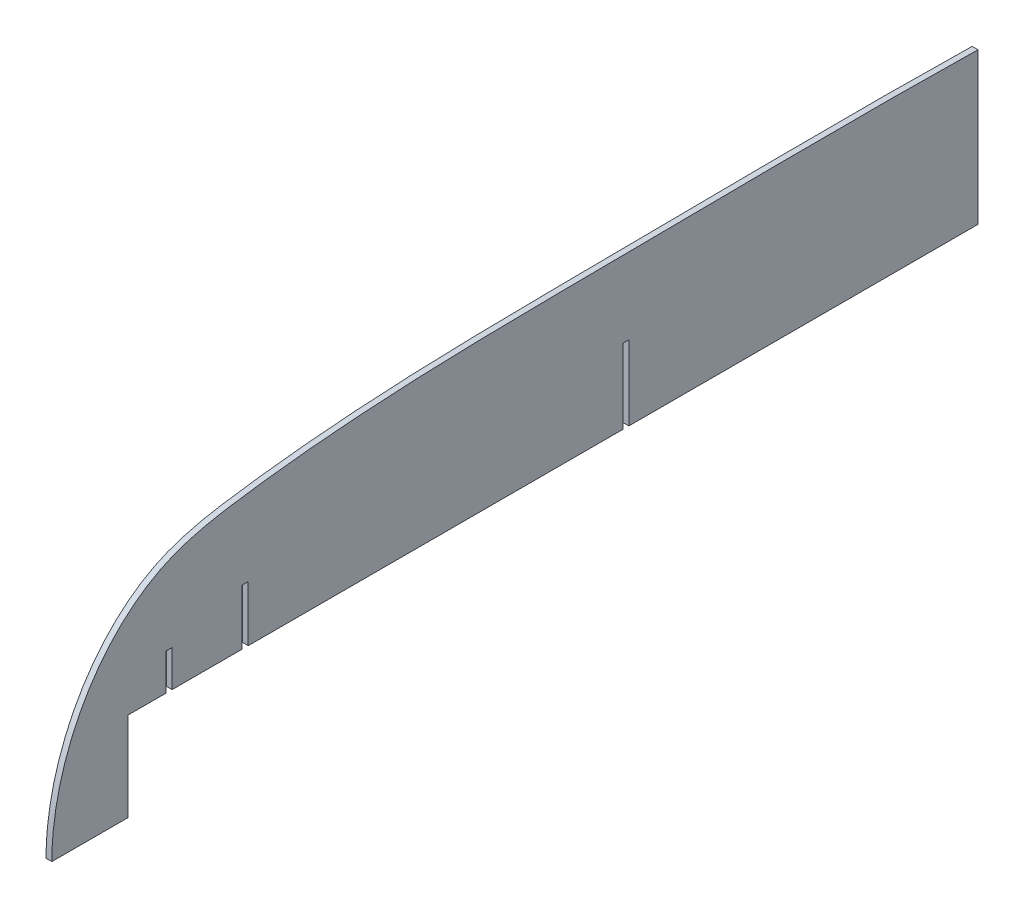
ISO-10303-21;
HEADER;
FILE_DESCRIPTION(('STEP AP214'),'2;1');
FILE_NAME('part.step','',(''),(''),'','','');
FILE_SCHEMA(('AUTOMOTIVE_DESIGN { 1 0 10303 214 1 1 1 1 }'));
ENDSEC;
DATA;
#1=APPLICATION_CONTEXT('core data for automotive mechanical design processes');
#2=APPLICATION_PROTOCOL_DEFINITION('international standard','automotive_design',2000,#1);
#3=PRODUCT_CONTEXT('',#1,'mechanical');
#4=PRODUCT('Part','Part','',(#3));
#5=PRODUCT_RELATED_PRODUCT_CATEGORY('part','',(#4));
#6=PRODUCT_DEFINITION_FORMATION('','',#4);
#7=PRODUCT_DEFINITION_CONTEXT('part definition',#1,'design');
#8=PRODUCT_DEFINITION('design','',#6,#7);
#9=PRODUCT_DEFINITION_SHAPE('','',#8);
#10=(LENGTH_UNIT() NAMED_UNIT(*) SI_UNIT(.MILLI.,.METRE.));
#11=(NAMED_UNIT(*) PLANE_ANGLE_UNIT() SI_UNIT($,.RADIAN.));
#12=(NAMED_UNIT(*) SI_UNIT($,.STERADIAN.) SOLID_ANGLE_UNIT());
#13=UNCERTAINTY_MEASURE_WITH_UNIT(LENGTH_MEASURE(1.E-05),#10,'distance_accuracy_value','');
#14=(GEOMETRIC_REPRESENTATION_CONTEXT(3) GLOBAL_UNCERTAINTY_ASSIGNED_CONTEXT((#13)) GLOBAL_UNIT_ASSIGNED_CONTEXT((#10,
#11,#12)) REPRESENTATION_CONTEXT('',''));
#15=CARTESIAN_POINT('',(0.,0.,0.));
#16=DIRECTION('',(0.,0.,1.));
#17=DIRECTION('',(1.,0.,0.));
#18=AXIS2_PLACEMENT_3D('',#15,#16,#17);
#19=CARTESIAN_POINT('',(2.921,39.6875,-381.));
#20=CARTESIAN_POINT('',(2.921,130.986638489082,-381.));
#21=CARTESIAN_POINT('',(2.921,207.087014824068,-192.838300002168));
#22=CARTESIAN_POINT('',(2.921,247.75344053516,19.653982034319));
#23=CARTESIAN_POINT('',(2.921,268.162472470018,254.872972462984));
#24=CARTESIAN_POINT('',(2.921,284.069445788471,549.517003243596));
#25=CARTESIAN_POINT('',(2.921,278.192638574035,889.863220578499));
#26=CARTESIAN_POINT('',(2.921,278.653196970913,1168.26453485061));
#27=CARTESIAN_POINT('',(2.921,238.643618873348,1400.44895878215));
#28=CARTESIAN_POINT('',(2.921,123.854582151285,1460.5));
#29=CARTESIAN_POINT('',(2.921,39.6875,1460.5));
#30=B_SPLINE_CURVE_WITH_KNOTS('',3,(#19,#20,#21,#22,#23,#24,#25,#26,#27,#28,#29),.UNSPECIFIED.,
.F.,.F.,(4,1,1,1,1,1,1,1,4),(0.,0.128798302419609,0.218593162728591,0.344649658829917,
0.470237251274815,0.658383603807385,0.846764992474732,0.885552356703056,1.),.UNSPECIFIED.);
#31=DIRECTION('',(-1.,0.,0.));
#32=VECTOR('',#31,1.);
#33=SURFACE_OF_LINEAR_EXTRUSION('',#30,#32);
#34=CARTESIAN_POINT('',(2.921,279.971033323289,533.4));
#35=VERTEX_POINT('',#34);
#36=CARTESIAN_POINT('',(2.921,39.6875,1460.5));
#37=VERTEX_POINT('',#36);
#38=EDGE_CURVE('E57',#35,#37,#30,.T.);
#39=ORIENTED_EDGE('',*,*,#38,.F.);
#40=DIRECTION('',(-1.,0.,0.));
#41=VECTOR('',#40,1.);
#42=CARTESIAN_POINT('',(2.921,279.971033323289,533.4));
#43=LINE('',#42,#41);
#44=CARTESIAN_POINT('',(-2.921,279.971033323289,533.4));
#45=VERTEX_POINT('',#44);
#46=EDGE_CURVE('E182',#35,#45,#43,.T.);
#47=ORIENTED_EDGE('',*,*,#46,.T.);
#48=CARTESIAN_POINT('',(-2.921,39.6875,-381.));
#49=CARTESIAN_POINT('',(-2.921,130.986638489082,-381.));
#50=CARTESIAN_POINT('',(-2.921,207.087014824068,-192.838300002168));
#51=CARTESIAN_POINT('',(-2.921,247.75344053516,19.653982034319));
#52=CARTESIAN_POINT('',(-2.921,268.162472470018,254.872972462984));
#53=CARTESIAN_POINT('',(-2.921,284.069445788471,549.517003243596));
#54=CARTESIAN_POINT('',(-2.921,278.192638574035,889.863220578499));
#55=CARTESIAN_POINT('',(-2.921,278.653196970913,1168.26453485061));
#56=CARTESIAN_POINT('',(-2.921,238.643618873348,1400.44895878215));
#57=CARTESIAN_POINT('',(-2.921,123.854582151285,1460.5));
#58=CARTESIAN_POINT('',(-2.921,39.6875,1460.5));
#59=B_SPLINE_CURVE_WITH_KNOTS('',3,(#48,#49,#50,#51,#52,#53,#54,#55,#56,#57,#58),.UNSPECIFIED.,
.F.,.F.,(4,1,1,1,1,1,1,1,4),(0.,0.128798302419609,0.218593162728591,0.344649658829917,
0.470237251274815,0.658383603807385,0.846764992474732,0.885552356703056,1.),.UNSPECIFIED.);
#60=CARTESIAN_POINT('',(-2.921,39.6875,1460.5));
#61=VERTEX_POINT('',#60);
#62=EDGE_CURVE('E179',#45,#61,#59,.T.);
#63=ORIENTED_EDGE('',*,*,#62,.T.);
#64=DIRECTION('',(-1.,0.,0.));
#65=VECTOR('',#64,1.);
#66=CARTESIAN_POINT('',(2.921,39.6875,1460.5));
#67=LINE('',#66,#65);
#68=EDGE_CURVE('E41',#37,#61,#67,.T.);
#69=ORIENTED_EDGE('',*,*,#68,.F.);
#70=EDGE_LOOP('',(#39,#47,#63,#69));
#71=FACE_BOUND('',#70,.T.);
#72=ADVANCED_FACE('F33',(#71),#33,.F.);
#73=CARTESIAN_POINT('',(2.921,39.6875,1460.5));
#74=DIRECTION('',(0.,1.,0.));
#75=DIRECTION('',(0.,0.,1.));
#76=AXIS2_PLACEMENT_3D('',#73,#74,#75);
#77=PLANE('',#76);
#78=DIRECTION('',(0.,0.,-1.));
#79=VECTOR('',#78,1.);
#80=CARTESIAN_POINT('',(-2.921,39.6875,1460.5));
#81=LINE('',#80,#79);
#82=CARTESIAN_POINT('',(-2.921,39.6875,1384.3));
#83=VERTEX_POINT('',#82);
#84=EDGE_CURVE('E171',#61,#83,#81,.T.);
#85=ORIENTED_EDGE('',*,*,#84,.T.);
#86=DIRECTION('',(1.,0.,0.));
#87=VECTOR('',#86,1.);
#88=CARTESIAN_POINT('',(-2.921,39.6875,1384.3));
#89=LINE('',#88,#87);
#90=CARTESIAN_POINT('',(2.921,39.6875,1384.3));
#91=VERTEX_POINT('',#90);
#92=EDGE_CURVE('E155',#83,#91,#89,.T.);
#93=ORIENTED_EDGE('',*,*,#92,.T.);
#94=DIRECTION('',(0.,0.,-1.));
#95=VECTOR('',#94,1.);
#96=CARTESIAN_POINT('',(2.921,39.6875,1460.5));
#97=LINE('',#96,#95);
#98=EDGE_CURVE('E181',#37,#91,#97,.T.);
#99=ORIENTED_EDGE('',*,*,#98,.F.);
#100=ORIENTED_EDGE('',*,*,#68,.T.);
#101=EDGE_LOOP('',(#85,#93,#99,#100));
#102=FACE_BOUND('',#101,.T.);
#103=ADVANCED_FACE('F177',(#102),#77,.F.);
#104=CARTESIAN_POINT('',(2.921,280.539048276461,568.161185702042));
#105=DIRECTION('',(1.,0.,0.));
#106=DIRECTION('',(0.,0.,-1.));
#107=AXIS2_PLACEMENT_3D('',#104,#105,#106);
#108=PLANE('',#107);
#109=DIRECTION('',(0.,-1.,0.));
#110=VECTOR('',#109,1.);
#111=CARTESIAN_POINT('',(2.921,39.6875,1384.3));
#112=LINE('',#111,#110);
#113=CARTESIAN_POINT('',(2.921,128.5875,1384.3));
#114=VERTEX_POINT('',#113);
#115=EDGE_CURVE('E161',#114,#91,#112,.T.);
#116=ORIENTED_EDGE('',*,*,#115,.F.);
#117=DIRECTION('',(0.,0.,1.));
#118=VECTOR('',#117,1.);
#119=CARTESIAN_POINT('',(2.921,128.5875,1384.3));
#120=LINE('',#119,#118);
#121=CARTESIAN_POINT('',(2.921,128.5875,1346.2));
#122=VERTEX_POINT('',#121);
#123=EDGE_CURVE('E175',#122,#114,#120,.T.);
#124=ORIENTED_EDGE('',*,*,#123,.F.);
#125=DIRECTION('',(0.,-1.,0.));
#126=VECTOR('',#125,1.);
#127=CARTESIAN_POINT('',(2.921,165.1,1346.2));
#128=LINE('',#127,#126);
#129=CARTESIAN_POINT('',(2.921,165.1,1346.2));
#130=VERTEX_POINT('',#129);
#131=EDGE_CURVE('E225',#130,#122,#128,.T.);
#132=ORIENTED_EDGE('',*,*,#131,.F.);
#133=DIRECTION('',(0.,0.,1.));
#134=VECTOR('',#133,1.);
#135=CARTESIAN_POINT('',(2.921,165.1,1346.2));
#136=LINE('',#135,#134);
#137=CARTESIAN_POINT('',(2.921,165.1,1340.104));
#138=VERTEX_POINT('',#137);
#139=EDGE_CURVE('E228',#138,#130,#136,.T.);
#140=ORIENTED_EDGE('',*,*,#139,.F.);
#141=DIRECTION('',(0.,1.,0.));
#142=VECTOR('',#141,1.);
#143=CARTESIAN_POINT('',(2.921,165.1,1340.104));
#144=LINE('',#143,#142);
#145=CARTESIAN_POINT('',(2.921,128.5875,1340.104));
#146=VERTEX_POINT('',#145);
#147=EDGE_CURVE('E231',#146,#138,#144,.T.);
#148=ORIENTED_EDGE('',*,*,#147,.F.);
#149=DIRECTION('',(0.,0.,1.));
#150=VECTOR('',#149,1.);
#151=CARTESIAN_POINT('',(2.921,128.5875,1340.104));
#152=LINE('',#151,#150);
#153=CARTESIAN_POINT('',(2.921,128.5875,1270.));
#154=VERTEX_POINT('',#153);
#155=EDGE_CURVE('E234',#154,#146,#152,.T.);
#156=ORIENTED_EDGE('',*,*,#155,.F.);
#157=DIRECTION('',(0.,-1.,0.));
#158=VECTOR('',#157,1.);
#159=CARTESIAN_POINT('',(2.921,184.15,1270.));
#160=LINE('',#159,#158);
#161=CARTESIAN_POINT('',(2.921,184.15,1270.));
#162=VERTEX_POINT('',#161);
#163=EDGE_CURVE('E237',#162,#154,#160,.T.);
#164=ORIENTED_EDGE('',*,*,#163,.F.);
#165=DIRECTION('',(0.,0.,1.));
#166=VECTOR('',#165,1.);
#167=CARTESIAN_POINT('',(2.921,184.15,1270.));
#168=LINE('',#167,#166);
#169=CARTESIAN_POINT('',(2.921,184.15,1263.904));
#170=VERTEX_POINT('',#169);
#171=EDGE_CURVE('E240',#170,#162,#168,.T.);
#172=ORIENTED_EDGE('',*,*,#171,.F.);
#173=DIRECTION('',(0.,1.,0.));
#174=VECTOR('',#173,1.);
#175=CARTESIAN_POINT('',(2.921,184.15,1263.904));
#176=LINE('',#175,#174);
#177=CARTESIAN_POINT('',(2.921,128.5875,1263.904));
#178=VERTEX_POINT('',#177);
#179=EDGE_CURVE('E243',#178,#170,#176,.T.);
#180=ORIENTED_EDGE('',*,*,#179,.F.);
#181=DIRECTION('',(0.,0.,1.));
#182=VECTOR('',#181,1.);
#183=CARTESIAN_POINT('',(2.921,128.5875,1263.904));
#184=LINE('',#183,#182);
#185=CARTESIAN_POINT('',(2.921,128.5875,889.));
#186=VERTEX_POINT('',#185);
#187=EDGE_CURVE('E246',#186,#178,#184,.T.);
#188=ORIENTED_EDGE('',*,*,#187,.F.);
#189=DIRECTION('',(0.,-1.,0.));
#190=VECTOR('',#189,1.);
#191=CARTESIAN_POINT('',(2.921,203.2,889.));
#192=LINE('',#191,#190);
#193=CARTESIAN_POINT('',(2.921,203.2,889.));
#194=VERTEX_POINT('',#193);
#195=EDGE_CURVE('E249',#194,#186,#192,.T.);
#196=ORIENTED_EDGE('',*,*,#195,.F.);
#197=DIRECTION('',(0.,0.,1.));
#198=VECTOR('',#197,1.);
#199=CARTESIAN_POINT('',(2.921,203.2,889.));
#200=LINE('',#199,#198);
#201=CARTESIAN_POINT('',(2.921,203.2,882.904));
#202=VERTEX_POINT('',#201);
#203=EDGE_CURVE('E252',#202,#194,#200,.T.);
#204=ORIENTED_EDGE('',*,*,#203,.F.);
#205=DIRECTION('',(0.,1.,0.));
#206=VECTOR('',#205,1.);
#207=CARTESIAN_POINT('',(2.921,203.2,882.904));
#208=LINE('',#207,#206);
#209=CARTESIAN_POINT('',(2.921,128.5875,882.904));
#210=VERTEX_POINT('',#209);
#211=EDGE_CURVE('E255',#210,#202,#208,.T.);
#212=ORIENTED_EDGE('',*,*,#211,.F.);
#213=DIRECTION('',(0.,0.,1.));
#214=VECTOR('',#213,1.);
#215=CARTESIAN_POINT('',(2.921,128.5875,882.904));
#216=LINE('',#215,#214);
#217=CARTESIAN_POINT('',(2.921,128.5875,533.4));
#218=VERTEX_POINT('',#217);
#219=EDGE_CURVE('E258',#218,#210,#216,.T.);
#220=ORIENTED_EDGE('',*,*,#219,.F.);
#221=DIRECTION('',(0.,-1.,0.));
#222=VECTOR('',#221,1.);
#223=CARTESIAN_POINT('',(2.921,128.5875,533.4));
#224=LINE('',#223,#222);
#225=EDGE_CURVE('E261',#35,#218,#224,.T.);
#226=ORIENTED_EDGE('',*,*,#225,.F.);
#227=ORIENTED_EDGE('',*,*,#38,.T.);
#228=ORIENTED_EDGE('',*,*,#98,.T.);
#229=EDGE_LOOP('',(#116,#124,#132,#140,#148,#156,#164,#172,#180,#188,#196,#204,#212,#220,#226,
#227,#228));
#230=FACE_BOUND('',#229,.T.);
#231=ADVANCED_FACE('F305',(#230),#108,.T.);
#232=CARTESIAN_POINT('',(-2.921,280.539048276461,568.161185702042));
#233=DIRECTION('',(1.,0.,0.));
#234=DIRECTION('',(0.,0.,-1.));
#235=AXIS2_PLACEMENT_3D('',#232,#233,#234);
#236=PLANE('',#235);
#237=DIRECTION('',(0.,0.,1.));
#238=VECTOR('',#237,1.);
#239=CARTESIAN_POINT('',(-2.921,128.5875,1384.3));
#240=LINE('',#239,#238);
#241=CARTESIAN_POINT('',(-2.921,128.5875,1346.2));
#242=VERTEX_POINT('',#241);
#243=CARTESIAN_POINT('',(-2.921,128.5875,1384.3));
#244=VERTEX_POINT('',#243);
#245=EDGE_CURVE('E165',#242,#244,#240,.T.);
#246=ORIENTED_EDGE('',*,*,#245,.T.);
#247=DIRECTION('',(0.,-1.,0.));
#248=VECTOR('',#247,1.);
#249=CARTESIAN_POINT('',(-2.921,39.6875,1384.3));
#250=LINE('',#249,#248);
#251=EDGE_CURVE('E158',#244,#83,#250,.T.);
#252=ORIENTED_EDGE('',*,*,#251,.T.);
#253=ORIENTED_EDGE('',*,*,#84,.F.);
#254=ORIENTED_EDGE('',*,*,#62,.F.);
#255=DIRECTION('',(0.,-1.,0.));
#256=VECTOR('',#255,1.);
#257=CARTESIAN_POINT('',(-2.921,280.539048276461,533.4));
#258=LINE('',#257,#256);
#259=CARTESIAN_POINT('',(-2.921,128.5875,533.4));
#260=VERTEX_POINT('',#259);
#261=EDGE_CURVE('E11',#45,#260,#258,.T.);
#262=ORIENTED_EDGE('',*,*,#261,.T.);
#263=DIRECTION('',(0.,0.,1.));
#264=VECTOR('',#263,1.);
#265=CARTESIAN_POINT('',(-2.921,128.5875,882.904));
#266=LINE('',#265,#264);
#267=CARTESIAN_POINT('',(-2.921,128.5875,882.904));
#268=VERTEX_POINT('',#267);
#269=EDGE_CURVE('E48',#260,#268,#266,.T.);
#270=ORIENTED_EDGE('',*,*,#269,.T.);
#271=DIRECTION('',(0.,1.,0.));
#272=VECTOR('',#271,1.);
#273=CARTESIAN_POINT('',(-2.921,203.2,882.904));
#274=LINE('',#273,#272);
#275=CARTESIAN_POINT('',(-2.921,203.2,882.904));
#276=VERTEX_POINT('',#275);
#277=EDGE_CURVE('E294',#268,#276,#274,.T.);
#278=ORIENTED_EDGE('',*,*,#277,.T.);
#279=DIRECTION('',(0.,0.,1.));
#280=VECTOR('',#279,1.);
#281=CARTESIAN_POINT('',(-2.921,203.2,889.));
#282=LINE('',#281,#280);
#283=CARTESIAN_POINT('',(-2.921,203.2,889.));
#284=VERTEX_POINT('',#283);
#285=EDGE_CURVE('E291',#276,#284,#282,.T.);
#286=ORIENTED_EDGE('',*,*,#285,.T.);
#287=DIRECTION('',(0.,-1.,0.));
#288=VECTOR('',#287,1.);
#289=CARTESIAN_POINT('',(-2.921,203.2,889.));
#290=LINE('',#289,#288);
#291=CARTESIAN_POINT('',(-2.921,128.5875,889.));
#292=VERTEX_POINT('',#291);
#293=EDGE_CURVE('E288',#284,#292,#290,.T.);
#294=ORIENTED_EDGE('',*,*,#293,.T.);
#295=DIRECTION('',(0.,0.,1.));
#296=VECTOR('',#295,1.);
#297=CARTESIAN_POINT('',(-2.921,128.5875,1263.904));
#298=LINE('',#297,#296);
#299=CARTESIAN_POINT('',(-2.921,128.5875,1263.904));
#300=VERTEX_POINT('',#299);
#301=EDGE_CURVE('E285',#292,#300,#298,.T.);
#302=ORIENTED_EDGE('',*,*,#301,.T.);
#303=DIRECTION('',(0.,1.,0.));
#304=VECTOR('',#303,1.);
#305=CARTESIAN_POINT('',(-2.921,184.15,1263.904));
#306=LINE('',#305,#304);
#307=CARTESIAN_POINT('',(-2.921,184.15,1263.904));
#308=VERTEX_POINT('',#307);
#309=EDGE_CURVE('E282',#300,#308,#306,.T.);
#310=ORIENTED_EDGE('',*,*,#309,.T.);
#311=DIRECTION('',(0.,0.,1.));
#312=VECTOR('',#311,1.);
#313=CARTESIAN_POINT('',(-2.921,184.15,1270.));
#314=LINE('',#313,#312);
#315=CARTESIAN_POINT('',(-2.921,184.15,1270.));
#316=VERTEX_POINT('',#315);
#317=EDGE_CURVE('E279',#308,#316,#314,.T.);
#318=ORIENTED_EDGE('',*,*,#317,.T.);
#319=DIRECTION('',(0.,-1.,0.));
#320=VECTOR('',#319,1.);
#321=CARTESIAN_POINT('',(-2.921,184.15,1270.));
#322=LINE('',#321,#320);
#323=CARTESIAN_POINT('',(-2.921,128.5875,1270.));
#324=VERTEX_POINT('',#323);
#325=EDGE_CURVE('E276',#316,#324,#322,.T.);
#326=ORIENTED_EDGE('',*,*,#325,.T.);
#327=DIRECTION('',(0.,0.,1.));
#328=VECTOR('',#327,1.);
#329=CARTESIAN_POINT('',(-2.921,128.5875,1340.104));
#330=LINE('',#329,#328);
#331=CARTESIAN_POINT('',(-2.921,128.5875,1340.104));
#332=VERTEX_POINT('',#331);
#333=EDGE_CURVE('E273',#324,#332,#330,.T.);
#334=ORIENTED_EDGE('',*,*,#333,.T.);
#335=DIRECTION('',(0.,1.,0.));
#336=VECTOR('',#335,1.);
#337=CARTESIAN_POINT('',(-2.921,165.1,1340.104));
#338=LINE('',#337,#336);
#339=CARTESIAN_POINT('',(-2.921,165.1,1340.104));
#340=VERTEX_POINT('',#339);
#341=EDGE_CURVE('E270',#332,#340,#338,.T.);
#342=ORIENTED_EDGE('',*,*,#341,.T.);
#343=DIRECTION('',(0.,0.,1.));
#344=VECTOR('',#343,1.);
#345=CARTESIAN_POINT('',(-2.921,165.1,1346.2));
#346=LINE('',#345,#344);
#347=CARTESIAN_POINT('',(-2.921,165.1,1346.2));
#348=VERTEX_POINT('',#347);
#349=EDGE_CURVE('E267',#340,#348,#346,.T.);
#350=ORIENTED_EDGE('',*,*,#349,.T.);
#351=DIRECTION('',(0.,-1.,0.));
#352=VECTOR('',#351,1.);
#353=CARTESIAN_POINT('',(-2.921,165.1,1346.2));
#354=LINE('',#353,#352);
#355=EDGE_CURVE('E265',#348,#242,#354,.T.);
#356=ORIENTED_EDGE('',*,*,#355,.T.);
#357=EDGE_LOOP('',(#246,#252,#253,#254,#262,#270,#278,#286,#294,#302,#310,#318,#326,#334,#342,
#350,#356));
#358=FACE_BOUND('',#357,.T.);
#359=ADVANCED_FACE('F169',(#358),#236,.F.);
#360=CARTESIAN_POINT('',(-2.921,128.5875,533.4));
#361=DIRECTION('',(0.,0.,1.));
#362=DIRECTION('',(1.,0.,0.));
#363=AXIS2_PLACEMENT_3D('',#360,#361,#362);
#364=PLANE('',#363);
#365=ORIENTED_EDGE('',*,*,#225,.T.);
#366=DIRECTION('',(1.,0.,0.));
#367=VECTOR('',#366,1.);
#368=CARTESIAN_POINT('',(-2.921,128.5875,533.4));
#369=LINE('',#368,#367);
#370=EDGE_CURVE('E164',#260,#218,#369,.T.);
#371=ORIENTED_EDGE('',*,*,#370,.F.);
#372=ORIENTED_EDGE('',*,*,#261,.F.);
#373=ORIENTED_EDGE('',*,*,#46,.F.);
#374=EDGE_LOOP('',(#365,#371,#372,#373));
#375=FACE_BOUND('',#374,.T.);
#376=ADVANCED_FACE('F299',(#375),#364,.F.);
#377=CARTESIAN_POINT('',(-2.921,39.6875,1384.3));
#378=DIRECTION('',(0.,0.,1.));
#379=DIRECTION('',(0.,-1.,0.));
#380=AXIS2_PLACEMENT_3D('',#377,#378,#379);
#381=PLANE('',#380);
#382=ORIENTED_EDGE('',*,*,#115,.T.);
#383=ORIENTED_EDGE('',*,*,#92,.F.);
#384=ORIENTED_EDGE('',*,*,#251,.F.);
#385=DIRECTION('',(1.,0.,0.));
#386=VECTOR('',#385,1.);
#387=CARTESIAN_POINT('',(-2.921,128.5875,1384.3));
#388=LINE('',#387,#386);
#389=EDGE_CURVE('E195',#244,#114,#388,.T.);
#390=ORIENTED_EDGE('',*,*,#389,.T.);
#391=EDGE_LOOP('',(#382,#383,#384,#390));
#392=FACE_BOUND('',#391,.T.);
#393=ADVANCED_FACE('F157',(#392),#381,.F.);
#394=CARTESIAN_POINT('',(-2.921,128.5875,1384.3));
#395=DIRECTION('',(0.,1.,0.));
#396=DIRECTION('',(0.,0.,1.));
#397=AXIS2_PLACEMENT_3D('',#394,#395,#396);
#398=PLANE('',#397);
#399=ORIENTED_EDGE('',*,*,#123,.T.);
#400=ORIENTED_EDGE('',*,*,#389,.F.);
#401=ORIENTED_EDGE('',*,*,#245,.F.);
#402=DIRECTION('',(1.,0.,0.));
#403=VECTOR('',#402,1.);
#404=CARTESIAN_POINT('',(-2.921,128.5875,1346.2));
#405=LINE('',#404,#403);
#406=EDGE_CURVE('E220',#242,#122,#405,.T.);
#407=ORIENTED_EDGE('',*,*,#406,.T.);
#408=EDGE_LOOP('',(#399,#400,#401,#407));
#409=FACE_BOUND('',#408,.T.);
#410=ADVANCED_FACE('F315',(#409),#398,.F.);
#411=CARTESIAN_POINT('',(-2.921,165.1,1346.2));
#412=DIRECTION('',(0.,0.,1.));
#413=DIRECTION('',(1.,0.,0.));
#414=AXIS2_PLACEMENT_3D('',#411,#412,#413);
#415=PLANE('',#414);
#416=ORIENTED_EDGE('',*,*,#131,.T.);
#417=ORIENTED_EDGE('',*,*,#406,.F.);
#418=ORIENTED_EDGE('',*,*,#355,.F.);
#419=DIRECTION('',(1.,0.,0.));
#420=VECTOR('',#419,1.);
#421=CARTESIAN_POINT('',(-2.921,165.1,1346.2));
#422=LINE('',#421,#420);
#423=EDGE_CURVE('E218',#348,#130,#422,.T.);
#424=ORIENTED_EDGE('',*,*,#423,.T.);
#425=EDGE_LOOP('',(#416,#417,#418,#424));
#426=FACE_BOUND('',#425,.T.);
#427=ADVANCED_FACE('F360',(#426),#415,.F.);
#428=CARTESIAN_POINT('',(-2.921,165.1,1346.2));
#429=DIRECTION('',(0.,1.,0.));
#430=DIRECTION('',(0.,0.,1.));
#431=AXIS2_PLACEMENT_3D('',#428,#429,#430);
#432=PLANE('',#431);
#433=ORIENTED_EDGE('',*,*,#139,.T.);
#434=ORIENTED_EDGE('',*,*,#423,.F.);
#435=ORIENTED_EDGE('',*,*,#349,.F.);
#436=DIRECTION('',(1.,0.,0.));
#437=VECTOR('',#436,1.);
#438=CARTESIAN_POINT('',(-2.921,165.1,1340.104));
#439=LINE('',#438,#437);
#440=EDGE_CURVE('E216',#340,#138,#439,.T.);
#441=ORIENTED_EDGE('',*,*,#440,.T.);
#442=EDGE_LOOP('',(#433,#434,#435,#441));
#443=FACE_BOUND('',#442,.T.);
#444=ADVANCED_FACE('F356',(#443),#432,.F.);
#445=CARTESIAN_POINT('',(-2.921,165.1,1340.104));
#446=DIRECTION('',(0.,0.,-1.));
#447=DIRECTION('',(-1.,0.,0.));
#448=AXIS2_PLACEMENT_3D('',#445,#446,#447);
#449=PLANE('',#448);
#450=ORIENTED_EDGE('',*,*,#147,.T.);
#451=ORIENTED_EDGE('',*,*,#440,.F.);
#452=ORIENTED_EDGE('',*,*,#341,.F.);
#453=DIRECTION('',(1.,0.,0.));
#454=VECTOR('',#453,1.);
#455=CARTESIAN_POINT('',(-2.921,128.5875,1340.104));
#456=LINE('',#455,#454);
#457=EDGE_CURVE('E214',#332,#146,#456,.T.);
#458=ORIENTED_EDGE('',*,*,#457,.T.);
#459=EDGE_LOOP('',(#450,#451,#452,#458));
#460=FACE_BOUND('',#459,.T.);
#461=ADVANCED_FACE('F352',(#460),#449,.F.);
#462=CARTESIAN_POINT('',(-2.921,128.5875,1340.104));
#463=DIRECTION('',(0.,1.,0.));
#464=DIRECTION('',(0.,0.,1.));
#465=AXIS2_PLACEMENT_3D('',#462,#463,#464);
#466=PLANE('',#465);
#467=ORIENTED_EDGE('',*,*,#155,.T.);
#468=ORIENTED_EDGE('',*,*,#457,.F.);
#469=ORIENTED_EDGE('',*,*,#333,.F.);
#470=DIRECTION('',(1.,0.,0.));
#471=VECTOR('',#470,1.);
#472=CARTESIAN_POINT('',(-2.921,128.5875,1270.));
#473=LINE('',#472,#471);
#474=EDGE_CURVE('E212',#324,#154,#473,.T.);
#475=ORIENTED_EDGE('',*,*,#474,.T.);
#476=EDGE_LOOP('',(#467,#468,#469,#475));
#477=FACE_BOUND('',#476,.T.);
#478=ADVANCED_FACE('F348',(#477),#466,.F.);
#479=CARTESIAN_POINT('',(-2.921,184.15,1270.));
#480=DIRECTION('',(0.,0.,1.));
#481=DIRECTION('',(1.,0.,0.));
#482=AXIS2_PLACEMENT_3D('',#479,#480,#481);
#483=PLANE('',#482);
#484=ORIENTED_EDGE('',*,*,#163,.T.);
#485=ORIENTED_EDGE('',*,*,#474,.F.);
#486=ORIENTED_EDGE('',*,*,#325,.F.);
#487=DIRECTION('',(1.,0.,0.));
#488=VECTOR('',#487,1.);
#489=CARTESIAN_POINT('',(-2.921,184.15,1270.));
#490=LINE('',#489,#488);
#491=EDGE_CURVE('E210',#316,#162,#490,.T.);
#492=ORIENTED_EDGE('',*,*,#491,.T.);
#493=EDGE_LOOP('',(#484,#485,#486,#492));
#494=FACE_BOUND('',#493,.T.);
#495=ADVANCED_FACE('F344',(#494),#483,.F.);
#496=CARTESIAN_POINT('',(-2.921,184.15,1270.));
#497=DIRECTION('',(0.,1.,0.));
#498=DIRECTION('',(0.,0.,1.));
#499=AXIS2_PLACEMENT_3D('',#496,#497,#498);
#500=PLANE('',#499);
#501=ORIENTED_EDGE('',*,*,#171,.T.);
#502=ORIENTED_EDGE('',*,*,#491,.F.);
#503=ORIENTED_EDGE('',*,*,#317,.F.);
#504=DIRECTION('',(1.,0.,0.));
#505=VECTOR('',#504,1.);
#506=CARTESIAN_POINT('',(-2.921,184.15,1263.904));
#507=LINE('',#506,#505);
#508=EDGE_CURVE('E208',#308,#170,#507,.T.);
#509=ORIENTED_EDGE('',*,*,#508,.T.);
#510=EDGE_LOOP('',(#501,#502,#503,#509));
#511=FACE_BOUND('',#510,.T.);
#512=ADVANCED_FACE('F340',(#511),#500,.F.);
#513=CARTESIAN_POINT('',(-2.921,184.15,1263.904));
#514=DIRECTION('',(0.,0.,-1.));
#515=DIRECTION('',(-1.,0.,0.));
#516=AXIS2_PLACEMENT_3D('',#513,#514,#515);
#517=PLANE('',#516);
#518=ORIENTED_EDGE('',*,*,#179,.T.);
#519=ORIENTED_EDGE('',*,*,#508,.F.);
#520=ORIENTED_EDGE('',*,*,#309,.F.);
#521=DIRECTION('',(1.,0.,0.));
#522=VECTOR('',#521,1.);
#523=CARTESIAN_POINT('',(-2.921,128.5875,1263.904));
#524=LINE('',#523,#522);
#525=EDGE_CURVE('E206',#300,#178,#524,.T.);
#526=ORIENTED_EDGE('',*,*,#525,.T.);
#527=EDGE_LOOP('',(#518,#519,#520,#526));
#528=FACE_BOUND('',#527,.T.);
#529=ADVANCED_FACE('F336',(#528),#517,.F.);
#530=CARTESIAN_POINT('',(-2.921,128.5875,1263.904));
#531=DIRECTION('',(0.,1.,0.));
#532=DIRECTION('',(0.,0.,1.));
#533=AXIS2_PLACEMENT_3D('',#530,#531,#532);
#534=PLANE('',#533);
#535=ORIENTED_EDGE('',*,*,#187,.T.);
#536=ORIENTED_EDGE('',*,*,#525,.F.);
#537=ORIENTED_EDGE('',*,*,#301,.F.);
#538=DIRECTION('',(1.,0.,0.));
#539=VECTOR('',#538,1.);
#540=CARTESIAN_POINT('',(-2.921,128.5875,889.));
#541=LINE('',#540,#539);
#542=EDGE_CURVE('E204',#292,#186,#541,.T.);
#543=ORIENTED_EDGE('',*,*,#542,.T.);
#544=EDGE_LOOP('',(#535,#536,#537,#543));
#545=FACE_BOUND('',#544,.T.);
#546=ADVANCED_FACE('F332',(#545),#534,.F.);
#547=CARTESIAN_POINT('',(-2.921,203.2,889.));
#548=DIRECTION('',(0.,0.,1.));
#549=DIRECTION('',(1.,0.,0.));
#550=AXIS2_PLACEMENT_3D('',#547,#548,#549);
#551=PLANE('',#550);
#552=ORIENTED_EDGE('',*,*,#195,.T.);
#553=ORIENTED_EDGE('',*,*,#542,.F.);
#554=ORIENTED_EDGE('',*,*,#293,.F.);
#555=DIRECTION('',(1.,0.,0.));
#556=VECTOR('',#555,1.);
#557=CARTESIAN_POINT('',(-2.921,203.2,889.));
#558=LINE('',#557,#556);
#559=EDGE_CURVE('E202',#284,#194,#558,.T.);
#560=ORIENTED_EDGE('',*,*,#559,.T.);
#561=EDGE_LOOP('',(#552,#553,#554,#560));
#562=FACE_BOUND('',#561,.T.);
#563=ADVANCED_FACE('F328',(#562),#551,.F.);
#564=CARTESIAN_POINT('',(-2.921,203.2,889.));
#565=DIRECTION('',(0.,1.,0.));
#566=DIRECTION('',(0.,0.,1.));
#567=AXIS2_PLACEMENT_3D('',#564,#565,#566);
#568=PLANE('',#567);
#569=ORIENTED_EDGE('',*,*,#203,.T.);
#570=ORIENTED_EDGE('',*,*,#559,.F.);
#571=ORIENTED_EDGE('',*,*,#285,.F.);
#572=DIRECTION('',(1.,0.,0.));
#573=VECTOR('',#572,1.);
#574=CARTESIAN_POINT('',(-2.921,203.2,882.904));
#575=LINE('',#574,#573);
#576=EDGE_CURVE('E200',#276,#202,#575,.T.);
#577=ORIENTED_EDGE('',*,*,#576,.T.);
#578=EDGE_LOOP('',(#569,#570,#571,#577));
#579=FACE_BOUND('',#578,.T.);
#580=ADVANCED_FACE('F324',(#579),#568,.F.);
#581=CARTESIAN_POINT('',(-2.921,203.2,882.904));
#582=DIRECTION('',(0.,0.,-1.));
#583=DIRECTION('',(-1.,0.,0.));
#584=AXIS2_PLACEMENT_3D('',#581,#582,#583);
#585=PLANE('',#584);
#586=ORIENTED_EDGE('',*,*,#211,.T.);
#587=ORIENTED_EDGE('',*,*,#576,.F.);
#588=ORIENTED_EDGE('',*,*,#277,.F.);
#589=DIRECTION('',(1.,0.,0.));
#590=VECTOR('',#589,1.);
#591=CARTESIAN_POINT('',(-2.921,128.5875,882.904));
#592=LINE('',#591,#590);
#593=EDGE_CURVE('E198',#268,#210,#592,.T.);
#594=ORIENTED_EDGE('',*,*,#593,.T.);
#595=EDGE_LOOP('',(#586,#587,#588,#594));
#596=FACE_BOUND('',#595,.T.);
#597=ADVANCED_FACE('F321',(#596),#585,.F.);
#598=CARTESIAN_POINT('',(-2.921,128.5875,882.904));
#599=DIRECTION('',(0.,1.,0.));
#600=DIRECTION('',(0.,0.,1.));
#601=AXIS2_PLACEMENT_3D('',#598,#599,#600);
#602=PLANE('',#601);
#603=ORIENTED_EDGE('',*,*,#219,.T.);
#604=ORIENTED_EDGE('',*,*,#593,.F.);
#605=ORIENTED_EDGE('',*,*,#269,.F.);
#606=ORIENTED_EDGE('',*,*,#370,.T.);
#607=EDGE_LOOP('',(#603,#604,#605,#606));
#608=FACE_BOUND('',#607,.T.);
#609=ADVANCED_FACE('F318',(#608),#602,.F.);
#610=CLOSED_SHELL('',(#72,#103,#231,#359,#376,#393,#410,#427,#444,#461,#478,#495,#512,#529,#546,
#563,#580,#597,#609));
#611=MANIFOLD_SOLID_BREP('B2',#610);
#612=ADVANCED_BREP_SHAPE_REPRESENTATION('',(#18,#611),#14);
#613=SHAPE_DEFINITION_REPRESENTATION(#9,#612);
ENDSEC;
END-ISO-10303-21;
